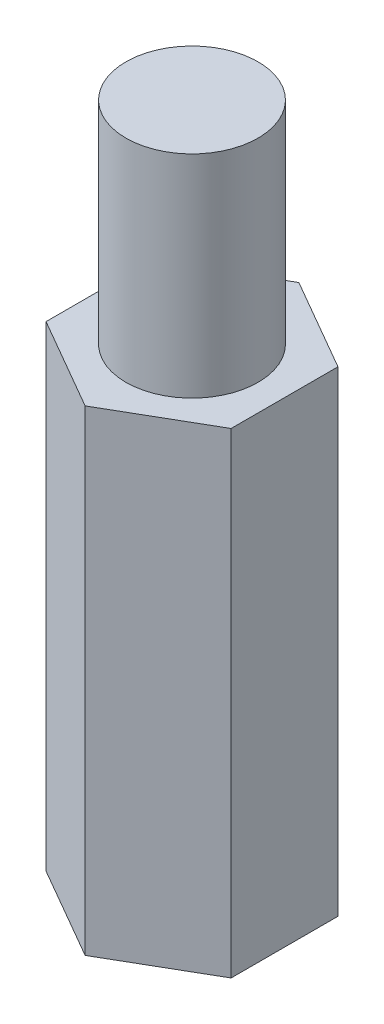
ISO-10303-21;
HEADER;
FILE_DESCRIPTION(('STEP AP214'),'2;1');
FILE_NAME('part.step','',(''),(''),'','','');
FILE_SCHEMA(('AUTOMOTIVE_DESIGN { 1 0 10303 214 1 1 1 1 }'));
ENDSEC;
DATA;
#1=APPLICATION_CONTEXT('core data for automotive mechanical design processes');
#2=APPLICATION_PROTOCOL_DEFINITION('international standard','automotive_design',2000,#1);
#3=PRODUCT_CONTEXT('',#1,'mechanical');
#4=PRODUCT('Part','Part','',(#3));
#5=PRODUCT_RELATED_PRODUCT_CATEGORY('part','',(#4));
#6=PRODUCT_DEFINITION_FORMATION('','',#4);
#7=PRODUCT_DEFINITION_CONTEXT('part definition',#1,'design');
#8=PRODUCT_DEFINITION('design','',#6,#7);
#9=PRODUCT_DEFINITION_SHAPE('','',#8);
#10=(LENGTH_UNIT() NAMED_UNIT(*) SI_UNIT(.MILLI.,.METRE.));
#11=(NAMED_UNIT(*) PLANE_ANGLE_UNIT() SI_UNIT($,.RADIAN.));
#12=(NAMED_UNIT(*) SI_UNIT($,.STERADIAN.) SOLID_ANGLE_UNIT());
#13=UNCERTAINTY_MEASURE_WITH_UNIT(LENGTH_MEASURE(1.E-05),#10,'distance_accuracy_value','');
#14=(GEOMETRIC_REPRESENTATION_CONTEXT(3) GLOBAL_UNCERTAINTY_ASSIGNED_CONTEXT((#13)) GLOBAL_UNIT_ASSIGNED_CONTEXT((#10,
#11,#12)) REPRESENTATION_CONTEXT('',''));
#15=CARTESIAN_POINT('',(0.,0.,0.));
#16=DIRECTION('',(0.,0.,1.));
#17=DIRECTION('',(1.,0.,0.));
#18=AXIS2_PLACEMENT_3D('',#15,#16,#17);
#19=CARTESIAN_POINT('',(-3.49999999999998,-0.0001,2.02072594216373));
#20=DIRECTION('',(-0.499999999999995,0.,0.866025403784441));
#21=DIRECTION('',(0.866025403784441,0.,0.499999999999995));
#22=AXIS2_PLACEMENT_3D('',#19,#20,#21);
#23=PLANE('',#22);
#24=DIRECTION('',(0.,1.,0.));
#25=VECTOR('',#24,1.);
#26=CARTESIAN_POINT('',(-3.49999999999998,-0.0001,2.02072594216373));
#27=LINE('',#26,#25);
#28=CARTESIAN_POINT('',(-3.49999999999998,11.9999,2.02072594216373));
#29=VERTEX_POINT('',#28);
#30=CARTESIAN_POINT('',(-3.49999999999998,30.,2.02072594216373));
#31=VERTEX_POINT('',#30);
#32=EDGE_CURVE('E46',#29,#31,#27,.T.);
#33=ORIENTED_EDGE('',*,*,#32,.F.);
#34=DIRECTION('',(0.866025403784441,0.,0.499999999999995));
#35=VECTOR('',#34,1.);
#36=CARTESIAN_POINT('',(-3.49999999999998,11.9999,2.02072594216373));
#37=LINE('',#36,#35);
#38=CARTESIAN_POINT('',(0.,11.9999,4.04145188432738));
#39=VERTEX_POINT('',#38);
#40=EDGE_CURVE('E94',#29,#39,#37,.T.);
#41=ORIENTED_EDGE('',*,*,#40,.T.);
#42=DIRECTION('',(0.,1.,0.));
#43=VECTOR('',#42,1.);
#44=CARTESIAN_POINT('',(0.,-0.0001,4.04145188432738));
#45=LINE('',#44,#43);
#46=CARTESIAN_POINT('',(0.,30.,4.04145188432738));
#47=VERTEX_POINT('',#46);
#48=EDGE_CURVE('E101',#39,#47,#45,.T.);
#49=ORIENTED_EDGE('',*,*,#48,.T.);
#50=DIRECTION('',(0.866025403784441,0.,0.499999999999995));
#51=VECTOR('',#50,1.);
#52=CARTESIAN_POINT('',(-3.49999999999998,30.,2.02072594216373));
#53=LINE('',#52,#51);
#54=EDGE_CURVE('E132',#31,#47,#53,.T.);
#55=ORIENTED_EDGE('',*,*,#54,.F.);
#56=EDGE_LOOP('',(#33,#41,#49,#55));
#57=FACE_BOUND('',#56,.T.);
#58=ADVANCED_FACE('F38',(#57),#23,.T.);
#59=CARTESIAN_POINT('',(-3.50000000000002,-0.0001,-2.02072594216366));
#60=DIRECTION('',(-1.,0.,0.));
#61=DIRECTION('',(0.,0.,1.));
#62=AXIS2_PLACEMENT_3D('',#59,#60,#61);
#63=PLANE('',#62);
#64=DIRECTION('',(0.,1.,0.));
#65=VECTOR('',#64,1.);
#66=CARTESIAN_POINT('',(-3.50000000000002,-0.0001,-2.02072594216366));
#67=LINE('',#66,#65);
#68=CARTESIAN_POINT('',(-3.50000000000002,11.9999,-2.02072594216366));
#69=VERTEX_POINT('',#68);
#70=CARTESIAN_POINT('',(-3.50000000000002,30.,-2.02072594216366));
#71=VERTEX_POINT('',#70);
#72=EDGE_CURVE('E120',#69,#71,#67,.T.);
#73=ORIENTED_EDGE('',*,*,#72,.F.);
#74=DIRECTION('',(0.,0.,1.));
#75=VECTOR('',#74,1.);
#76=CARTESIAN_POINT('',(-3.50000000000002,11.9999,-2.02072594216366));
#77=LINE('',#76,#75);
#78=EDGE_CURVE('E104',#69,#29,#77,.T.);
#79=ORIENTED_EDGE('',*,*,#78,.T.);
#80=ORIENTED_EDGE('',*,*,#32,.T.);
#81=DIRECTION('',(0.,0.,1.));
#82=VECTOR('',#81,1.);
#83=CARTESIAN_POINT('',(-3.50000000000002,30.,-2.02072594216366));
#84=LINE('',#83,#82);
#85=EDGE_CURVE('E111',#71,#31,#84,.T.);
#86=ORIENTED_EDGE('',*,*,#85,.F.);
#87=EDGE_LOOP('',(#73,#79,#80,#86));
#88=FACE_BOUND('',#87,.T.);
#89=ADVANCED_FACE('F160',(#88),#63,.T.);
#90=CARTESIAN_POINT('',(0.,-0.0001,-4.04145188432738));
#91=DIRECTION('',(-0.500000000000007,0.,-0.866025403784434));
#92=DIRECTION('',(-0.866025403784434,0.,0.500000000000007));
#93=AXIS2_PLACEMENT_3D('',#90,#91,#92);
#94=PLANE('',#93);
#95=DIRECTION('',(0.,1.,0.));
#96=VECTOR('',#95,1.);
#97=CARTESIAN_POINT('',(0.,-0.0001,-4.04145188432738));
#98=LINE('',#97,#96);
#99=CARTESIAN_POINT('',(0.,11.9999,-4.04145188432738));
#100=VERTEX_POINT('',#99);
#101=CARTESIAN_POINT('',(0.,30.,-4.04145188432738));
#102=VERTEX_POINT('',#101);
#103=EDGE_CURVE('E118',#100,#102,#98,.T.);
#104=ORIENTED_EDGE('',*,*,#103,.F.);
#105=DIRECTION('',(-0.866025403784434,0.,0.500000000000007));
#106=VECTOR('',#105,1.);
#107=CARTESIAN_POINT('',(0.,11.9999,-4.04145188432738));
#108=LINE('',#107,#106);
#109=EDGE_CURVE('E140',#100,#69,#108,.T.);
#110=ORIENTED_EDGE('',*,*,#109,.T.);
#111=ORIENTED_EDGE('',*,*,#72,.T.);
#112=DIRECTION('',(-0.866025403784434,0.,0.500000000000007));
#113=VECTOR('',#112,1.);
#114=CARTESIAN_POINT('',(0.,30.,-4.04145188432738));
#115=LINE('',#114,#113);
#116=EDGE_CURVE('E114',#102,#71,#115,.T.);
#117=ORIENTED_EDGE('',*,*,#116,.F.);
#118=EDGE_LOOP('',(#104,#110,#111,#117));
#119=FACE_BOUND('',#118,.T.);
#120=ADVANCED_FACE('F158',(#119),#94,.T.);
#121=CARTESIAN_POINT('',(3.49999999999999,-0.0001,-2.02072594216371));
#122=DIRECTION('',(0.499999999999995,0.,-0.866025403784441));
#123=DIRECTION('',(-0.866025403784441,0.,-0.499999999999995));
#124=AXIS2_PLACEMENT_3D('',#121,#122,#123);
#125=PLANE('',#124);
#126=DIRECTION('',(0.,1.,0.));
#127=VECTOR('',#126,1.);
#128=CARTESIAN_POINT('',(3.49999999999999,-0.0001,-2.02072594216371));
#129=LINE('',#128,#127);
#130=CARTESIAN_POINT('',(3.49999999999999,11.9999,-2.02072594216371));
#131=VERTEX_POINT('',#130);
#132=CARTESIAN_POINT('',(3.49999999999999,30.,-2.02072594216371));
#133=VERTEX_POINT('',#132);
#134=EDGE_CURVE('E112',#131,#133,#129,.T.);
#135=ORIENTED_EDGE('',*,*,#134,.F.);
#136=DIRECTION('',(-0.866025403784441,0.,-0.499999999999995));
#137=VECTOR('',#136,1.);
#138=CARTESIAN_POINT('',(3.49999999999999,11.9999,-2.02072594216371));
#139=LINE('',#138,#137);
#140=EDGE_CURVE('E143',#131,#100,#139,.T.);
#141=ORIENTED_EDGE('',*,*,#140,.T.);
#142=ORIENTED_EDGE('',*,*,#103,.T.);
#143=DIRECTION('',(-0.866025403784441,0.,-0.499999999999995));
#144=VECTOR('',#143,1.);
#145=CARTESIAN_POINT('',(3.49999999999999,30.,-2.02072594216371));
#146=LINE('',#145,#144);
#147=EDGE_CURVE('E125',#133,#102,#146,.T.);
#148=ORIENTED_EDGE('',*,*,#147,.F.);
#149=EDGE_LOOP('',(#135,#141,#142,#148));
#150=FACE_BOUND('',#149,.T.);
#151=ADVANCED_FACE('F152',(#150),#125,.T.);
#152=CARTESIAN_POINT('',(3.50000000000001,-0.0001,2.02072594216368));
#153=DIRECTION('',(1.,0.,0.));
#154=DIRECTION('',(0.,0.,-1.));
#155=AXIS2_PLACEMENT_3D('',#152,#153,#154);
#156=PLANE('',#155);
#157=DIRECTION('',(0.,1.,0.));
#158=VECTOR('',#157,1.);
#159=CARTESIAN_POINT('',(3.50000000000001,-0.0001,2.02072594216368));
#160=LINE('',#159,#158);
#161=CARTESIAN_POINT('',(3.50000000000001,11.9999,2.02072594216368));
#162=VERTEX_POINT('',#161);
#163=CARTESIAN_POINT('',(3.50000000000001,30.,2.02072594216368));
#164=VERTEX_POINT('',#163);
#165=EDGE_CURVE('E110',#162,#164,#160,.T.);
#166=ORIENTED_EDGE('',*,*,#165,.F.);
#167=DIRECTION('',(0.,0.,-1.));
#168=VECTOR('',#167,1.);
#169=CARTESIAN_POINT('',(3.50000000000001,11.9999,2.02072594216368));
#170=LINE('',#169,#168);
#171=EDGE_CURVE('E54',#162,#131,#170,.T.);
#172=ORIENTED_EDGE('',*,*,#171,.T.);
#173=ORIENTED_EDGE('',*,*,#134,.T.);
#174=DIRECTION('',(0.,0.,-1.));
#175=VECTOR('',#174,1.);
#176=CARTESIAN_POINT('',(3.50000000000001,30.,2.02072594216368));
#177=LINE('',#176,#175);
#178=EDGE_CURVE('E128',#164,#133,#177,.T.);
#179=ORIENTED_EDGE('',*,*,#178,.F.);
#180=EDGE_LOOP('',(#166,#172,#173,#179));
#181=FACE_BOUND('',#180,.T.);
#182=ADVANCED_FACE('F148',(#181),#156,.T.);
#183=CARTESIAN_POINT('',(0.,-0.0001,4.04145188432738));
#184=DIRECTION('',(0.500000000000001,0.,0.866025403784438));
#185=DIRECTION('',(0.866025403784438,0.,-0.500000000000001));
#186=AXIS2_PLACEMENT_3D('',#183,#184,#185);
#187=PLANE('',#186);
#188=ORIENTED_EDGE('',*,*,#48,.F.);
#189=DIRECTION('',(0.866025403784438,0.,-0.500000000000001));
#190=VECTOR('',#189,1.);
#191=CARTESIAN_POINT('',(0.,11.9999,4.04145188432738));
#192=LINE('',#191,#190);
#193=EDGE_CURVE('E90',#39,#162,#192,.T.);
#194=ORIENTED_EDGE('',*,*,#193,.T.);
#195=ORIENTED_EDGE('',*,*,#165,.T.);
#196=DIRECTION('',(0.866025403784438,0.,-0.500000000000001));
#197=VECTOR('',#196,1.);
#198=CARTESIAN_POINT('',(0.,30.,4.04145188432738));
#199=LINE('',#198,#197);
#200=EDGE_CURVE('E108',#47,#164,#199,.T.);
#201=ORIENTED_EDGE('',*,*,#200,.F.);
#202=EDGE_LOOP('',(#188,#194,#195,#201));
#203=FACE_BOUND('',#202,.T.);
#204=ADVANCED_FACE('F106',(#203),#187,.T.);
#205=CARTESIAN_POINT('',(0.,30.,0.));
#206=DIRECTION('',(0.,1.,0.));
#207=DIRECTION('',(0.,0.,1.));
#208=AXIS2_PLACEMENT_3D('',#205,#206,#207);
#209=PLANE('',#208);
#210=CARTESIAN_POINT('',(0.,30.,0.));
#211=DIRECTION('',(0.,1.,0.));
#212=DIRECTION('',(0.,0.,1.));
#213=AXIS2_PLACEMENT_3D('',#210,#211,#212);
#214=CIRCLE('',#213,2.5);
#215=CARTESIAN_POINT('',(0.,30.,2.5));
#216=VERTEX_POINT('',#215);
#217=EDGE_CURVE('E11',#216,#216,#214,.T.);
#218=ORIENTED_EDGE('',*,*,#217,.F.);
#219=EDGE_LOOP('',(#218));
#220=FACE_BOUND('',#219,.T.);
#221=ORIENTED_EDGE('',*,*,#54,.T.);
#222=ORIENTED_EDGE('',*,*,#200,.T.);
#223=ORIENTED_EDGE('',*,*,#178,.T.);
#224=ORIENTED_EDGE('',*,*,#147,.T.);
#225=ORIENTED_EDGE('',*,*,#116,.T.);
#226=ORIENTED_EDGE('',*,*,#85,.T.);
#227=EDGE_LOOP('',(#221,#222,#223,#224,#225,#226));
#228=FACE_BOUND('',#227,.T.);
#229=ADVANCED_FACE('F156',(#220,#228),#209,.T.);
#230=CARTESIAN_POINT('',(0.,38.,0.));
#231=DIRECTION('',(0.,-1.,0.));
#232=DIRECTION('',(0.,0.,-1.));
#233=AXIS2_PLACEMENT_3D('',#230,#231,#232);
#234=CYLINDRICAL_SURFACE('',#233,2.5);
#235=CARTESIAN_POINT('',(0.,38.,0.));
#236=DIRECTION('',(0.,1.,0.));
#237=DIRECTION('',(0.,0.,1.));
#238=AXIS2_PLACEMENT_3D('',#235,#236,#237);
#239=CIRCLE('',#238,2.5);
#240=CARTESIAN_POINT('',(0.,38.,2.5));
#241=VERTEX_POINT('',#240);
#242=EDGE_CURVE('E103',#241,#241,#239,.T.);
#243=ORIENTED_EDGE('',*,*,#242,.F.);
#244=EDGE_LOOP('',(#243));
#245=FACE_BOUND('',#244,.T.);
#246=ORIENTED_EDGE('',*,*,#217,.T.);
#247=EDGE_LOOP('',(#246));
#248=FACE_BOUND('',#247,.T.);
#249=ADVANCED_FACE('F178',(#245,#248),#234,.T.);
#250=CARTESIAN_POINT('',(0.,38.,0.));
#251=DIRECTION('',(0.,1.,0.));
#252=DIRECTION('',(0.,0.,1.));
#253=AXIS2_PLACEMENT_3D('',#250,#251,#252);
#254=PLANE('',#253);
#255=ORIENTED_EDGE('',*,*,#242,.T.);
#256=EDGE_LOOP('',(#255));
#257=FACE_BOUND('',#256,.T.);
#258=ADVANCED_FACE('F183',(#257),#254,.T.);
#259=CARTESIAN_POINT('',(-3.08604433135429,11.9999,4.46526326412311));
#260=DIRECTION('',(0.,-1.,0.));
#261=DIRECTION('',(0.,0.,-1.));
#262=AXIS2_PLACEMENT_3D('',#259,#260,#261);
#263=PLANE('',#262);
#264=ORIENTED_EDGE('',*,*,#78,.F.);
#265=ORIENTED_EDGE('',*,*,#109,.F.);
#266=ORIENTED_EDGE('',*,*,#140,.F.);
#267=ORIENTED_EDGE('',*,*,#171,.F.);
#268=ORIENTED_EDGE('',*,*,#193,.F.);
#269=ORIENTED_EDGE('',*,*,#40,.F.);
#270=EDGE_LOOP('',(#264,#265,#266,#267,#268,#269));
#271=FACE_BOUND('',#270,.T.);
#272=CARTESIAN_POINT('',(0.,11.9999,0.));
#273=DIRECTION('',(0.,-1.,0.));
#274=DIRECTION('',(0.,0.,-1.));
#275=AXIS2_PLACEMENT_3D('',#272,#273,#274);
#276=CIRCLE('',#275,2.5);
#277=CARTESIAN_POINT('',(0.,11.9999,-2.5));
#278=VERTEX_POINT('',#277);
#279=EDGE_CURVE('E41',#278,#278,#276,.F.);
#280=ORIENTED_EDGE('',*,*,#279,.T.);
#281=EDGE_LOOP('',(#280));
#282=FACE_BOUND('',#281,.T.);
#283=ADVANCED_FACE('F92',(#271,#282),#263,.T.);
#284=CARTESIAN_POINT('',(0.,19.9999,0.));
#285=DIRECTION('',(0.,-1.,0.));
#286=DIRECTION('',(0.,0.,-1.));
#287=AXIS2_PLACEMENT_3D('',#284,#285,#286);
#288=PLANE('',#287);
#289=CARTESIAN_POINT('',(0.,19.9999,0.));
#290=DIRECTION('',(0.,-1.,0.));
#291=DIRECTION('',(0.,0.,-1.));
#292=AXIS2_PLACEMENT_3D('',#289,#290,#291);
#293=CIRCLE('',#292,2.5);
#294=CARTESIAN_POINT('',(0.,19.9999,-2.5));
#295=VERTEX_POINT('',#294);
#296=EDGE_CURVE('E134',#295,#295,#293,.T.);
#297=ORIENTED_EDGE('',*,*,#296,.T.);
#298=EDGE_LOOP('',(#297));
#299=FACE_BOUND('',#298,.T.);
#300=ADVANCED_FACE('F196',(#299),#288,.T.);
#301=CARTESIAN_POINT('',(0.,19.9999,0.));
#302=DIRECTION('',(0.,-1.,0.));
#303=DIRECTION('',(0.,0.,-1.));
#304=AXIS2_PLACEMENT_3D('',#301,#302,#303);
#305=CYLINDRICAL_SURFACE('',#304,2.5);
#306=ORIENTED_EDGE('',*,*,#296,.F.);
#307=EDGE_LOOP('',(#306));
#308=FACE_BOUND('',#307,.T.);
#309=ORIENTED_EDGE('',*,*,#279,.F.);
#310=EDGE_LOOP('',(#309));
#311=FACE_BOUND('',#310,.T.);
#312=ADVANCED_FACE('F198',(#308,#311),#305,.F.);
#313=CLOSED_SHELL('',(#58,#89,#120,#151,#182,#204,#229,#249,#258,#283,#300,#312));
#314=MANIFOLD_SOLID_BREP('B2',#313);
#315=ADVANCED_BREP_SHAPE_REPRESENTATION('',(#18,#314),#14);
#316=SHAPE_DEFINITION_REPRESENTATION(#9,#315);
ENDSEC;
END-ISO-10303-21;
